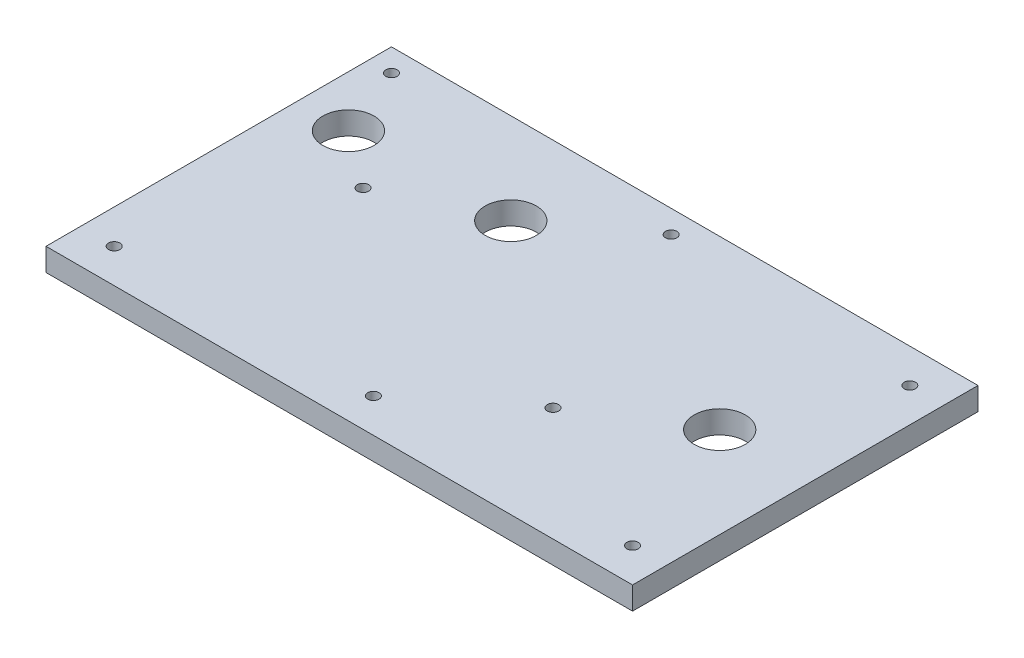
ISO-10303-21;
HEADER;
FILE_DESCRIPTION(('STEP AP214'),'2;1');
FILE_NAME('part.step','',(''),(''),'','','');
FILE_SCHEMA(('AUTOMOTIVE_DESIGN { 1 0 10303 214 1 1 1 1 }'));
ENDSEC;
DATA;
#1=APPLICATION_CONTEXT('core data for automotive mechanical design processes');
#2=APPLICATION_PROTOCOL_DEFINITION('international standard','automotive_design',2000,#1);
#3=PRODUCT_CONTEXT('',#1,'mechanical');
#4=PRODUCT('Part','Part','',(#3));
#5=PRODUCT_RELATED_PRODUCT_CATEGORY('part','',(#4));
#6=PRODUCT_DEFINITION_FORMATION('','',#4);
#7=PRODUCT_DEFINITION_CONTEXT('part definition',#1,'design');
#8=PRODUCT_DEFINITION('design','',#6,#7);
#9=PRODUCT_DEFINITION_SHAPE('','',#8);
#10=(LENGTH_UNIT() NAMED_UNIT(*) SI_UNIT(.MILLI.,.METRE.));
#11=(NAMED_UNIT(*) PLANE_ANGLE_UNIT() SI_UNIT($,.RADIAN.));
#12=(NAMED_UNIT(*) SI_UNIT($,.STERADIAN.) SOLID_ANGLE_UNIT());
#13=UNCERTAINTY_MEASURE_WITH_UNIT(LENGTH_MEASURE(1.E-05),#10,'distance_accuracy_value','');
#14=(GEOMETRIC_REPRESENTATION_CONTEXT(3) GLOBAL_UNCERTAINTY_ASSIGNED_CONTEXT((#13)) GLOBAL_UNIT_ASSIGNED_CONTEXT((#10,
#11,#12)) REPRESENTATION_CONTEXT('',''));
#15=CARTESIAN_POINT('',(0.,0.,0.));
#16=DIRECTION('',(0.,0.,1.));
#17=DIRECTION('',(1.,0.,0.));
#18=AXIS2_PLACEMENT_3D('',#15,#16,#17);
#19=CARTESIAN_POINT('',(0.,12.7,0.));
#20=DIRECTION('',(0.,1.,0.));
#21=DIRECTION('',(0.,0.,1.));
#22=AXIS2_PLACEMENT_3D('',#19,#20,#21);
#23=PLANE('',#22);
#24=CARTESIAN_POINT('',(-57.15,12.7,25.4));
#25=DIRECTION('',(0.,1.,0.));
#26=DIRECTION('',(0.,0.,1.));
#27=AXIS2_PLACEMENT_3D('',#24,#25,#26);
#28=CIRCLE('',#27,3.175);
#29=CARTESIAN_POINT('',(-57.15,12.7,28.575));
#30=VERTEX_POINT('',#29);
#31=EDGE_CURVE('E202',#30,#30,#28,.T.);
#32=ORIENTED_EDGE('',*,*,#31,.F.);
#33=EDGE_LOOP('',(#32));
#34=FACE_BOUND('',#33,.T.);
#35=CARTESIAN_POINT('',(46.3996786,12.7,123.19));
#36=DIRECTION('',(0.,1.,0.));
#37=DIRECTION('',(0.,0.,1.));
#38=AXIS2_PLACEMENT_3D('',#35,#36,#37);
#39=CIRCLE('',#38,3.175);
#40=CARTESIAN_POINT('',(46.3996786,12.7,126.365));
#41=VERTEX_POINT('',#40);
#42=EDGE_CURVE('E186',#41,#41,#39,.T.);
#43=ORIENTED_EDGE('',*,*,#42,.F.);
#44=EDGE_LOOP('',(#43));
#45=FACE_BOUND('',#44,.T.);
#46=CARTESIAN_POINT('',(191.224353920325,12.7,-31.75));
#47=DIRECTION('',(0.,1.,0.));
#48=DIRECTION('',(0.,0.,1.));
#49=AXIS2_PLACEMENT_3D('',#46,#47,#48);
#50=CIRCLE('',#49,3.175);
#51=CARTESIAN_POINT('',(191.224353920325,12.7,-28.575));
#52=VERTEX_POINT('',#51);
#53=EDGE_CURVE('E170',#52,#52,#50,.T.);
#54=ORIENTED_EDGE('',*,*,#53,.F.);
#55=EDGE_LOOP('',(#54));
#56=FACE_BOUND('',#55,.T.);
#57=CARTESIAN_POINT('',(-98.425,12.7,123.19));
#58=DIRECTION('',(0.,1.,0.));
#59=DIRECTION('',(0.,0.,1.));
#60=AXIS2_PLACEMENT_3D('',#57,#58,#59);
#61=CIRCLE('',#60,3.175);
#62=CARTESIAN_POINT('',(-98.425,12.7,126.365));
#63=VERTEX_POINT('',#62);
#64=EDGE_CURVE('E154',#63,#63,#61,.T.);
#65=ORIENTED_EDGE('',*,*,#64,.F.);
#66=EDGE_LOOP('',(#65));
#67=FACE_BOUND('',#66,.T.);
#68=CARTESIAN_POINT('',(159.474353920325,12.7,42.7310243464263));
#69=DIRECTION('',(0.,1.,0.));
#70=DIRECTION('',(0.,0.,1.));
#71=AXIS2_PLACEMENT_3D('',#68,#69,#70);
#72=CIRCLE('',#71,14.2875);
#73=CARTESIAN_POINT('',(159.474353920325,12.7,57.0185243464263));
#74=VERTEX_POINT('',#73);
#75=EDGE_CURVE('E138',#74,#74,#72,.T.);
#76=ORIENTED_EDGE('',*,*,#75,.F.);
#77=EDGE_LOOP('',(#76));
#78=FACE_BOUND('',#77,.T.);
#79=DIRECTION('',(0.,0.,1.));
#80=VECTOR('',#79,1.);
#81=CARTESIAN_POINT('',(-117.475,12.7,-50.8));
#82=LINE('',#81,#80);
#83=CARTESIAN_POINT('',(-117.475,12.7,-50.8));
#84=VERTEX_POINT('',#83);
#85=CARTESIAN_POINT('',(-117.475,12.7,142.24));
#86=VERTEX_POINT('',#85);
#87=EDGE_CURVE('E96',#84,#86,#82,.T.);
#88=ORIENTED_EDGE('',*,*,#87,.T.);
#89=DIRECTION('',(1.,0.,0.));
#90=VECTOR('',#89,1.);
#91=CARTESIAN_POINT('',(-117.475,12.7,142.24));
#92=LINE('',#91,#90);
#93=CARTESIAN_POINT('',(210.274353920325,12.7,142.24));
#94=VERTEX_POINT('',#93);
#95=EDGE_CURVE('E91',#86,#94,#92,.T.);
#96=ORIENTED_EDGE('',*,*,#95,.T.);
#97=DIRECTION('',(0.,0.,-1.));
#98=VECTOR('',#97,1.);
#99=CARTESIAN_POINT('',(210.274353920325,12.7,-50.8));
#100=LINE('',#99,#98);
#101=CARTESIAN_POINT('',(210.274353920325,12.7,-50.8));
#102=VERTEX_POINT('',#101);
#103=EDGE_CURVE('E94',#94,#102,#100,.T.);
#104=ORIENTED_EDGE('',*,*,#103,.T.);
#105=DIRECTION('',(-1.,0.,0.));
#106=VECTOR('',#105,1.);
#107=CARTESIAN_POINT('',(-117.475,12.7,-50.8));
#108=LINE('',#107,#106);
#109=EDGE_CURVE('E61',#102,#84,#108,.T.);
#110=ORIENTED_EDGE('',*,*,#109,.T.);
#111=EDGE_LOOP('',(#88,#96,#104,#110));
#112=FACE_BOUND('',#111,.T.);
#113=CARTESIAN_POINT('',(0.,12.7,0.));
#114=DIRECTION('',(0.,1.,0.));
#115=DIRECTION('',(0.,0.,1.));
#116=AXIS2_PLACEMENT_3D('',#113,#114,#115);
#117=CIRCLE('',#116,14.2875);
#118=CARTESIAN_POINT('',(0.,12.7,14.2875));
#119=VERTEX_POINT('',#118);
#120=EDGE_CURVE('E116',#119,#119,#117,.T.);
#121=ORIENTED_EDGE('',*,*,#120,.F.);
#122=EDGE_LOOP('',(#121));
#123=FACE_BOUND('',#122,.T.);
#124=CARTESIAN_POINT('',(-88.9,12.7,1.8179314007295));
#125=DIRECTION('',(0.,1.,0.));
#126=DIRECTION('',(0.,0.,1.));
#127=AXIS2_PLACEMENT_3D('',#124,#125,#126);
#128=CIRCLE('',#127,14.2875);
#129=CARTESIAN_POINT('',(-88.9,12.7,16.1054314007295));
#130=VERTEX_POINT('',#129);
#131=EDGE_CURVE('E146',#130,#130,#128,.T.);
#132=ORIENTED_EDGE('',*,*,#131,.F.);
#133=EDGE_LOOP('',(#132));
#134=FACE_BOUND('',#133,.T.);
#135=CARTESIAN_POINT('',(191.224353920325,12.7,123.19));
#136=DIRECTION('',(0.,1.,0.));
#137=DIRECTION('',(0.,0.,1.));
#138=AXIS2_PLACEMENT_3D('',#135,#136,#137);
#139=CIRCLE('',#138,3.175);
#140=CARTESIAN_POINT('',(191.224353920325,12.7,126.365));
#141=VERTEX_POINT('',#140);
#142=EDGE_CURVE('E162',#141,#141,#139,.T.);
#143=ORIENTED_EDGE('',*,*,#142,.F.);
#144=EDGE_LOOP('',(#143));
#145=FACE_BOUND('',#144,.T.);
#146=CARTESIAN_POINT('',(102.324353920325,12.7,78.74));
#147=DIRECTION('',(0.,1.,0.));
#148=DIRECTION('',(0.,0.,1.));
#149=AXIS2_PLACEMENT_3D('',#146,#147,#148);
#150=CIRCLE('',#149,3.175);
#151=CARTESIAN_POINT('',(102.324353920325,12.7,81.915));
#152=VERTEX_POINT('',#151);
#153=EDGE_CURVE('E178',#152,#152,#150,.T.);
#154=ORIENTED_EDGE('',*,*,#153,.F.);
#155=EDGE_LOOP('',(#154));
#156=FACE_BOUND('',#155,.T.);
#157=CARTESIAN_POINT('',(-104.775,12.7,-38.1));
#158=DIRECTION('',(0.,1.,0.));
#159=DIRECTION('',(0.,0.,1.));
#160=AXIS2_PLACEMENT_3D('',#157,#158,#159);
#161=CIRCLE('',#160,3.175);
#162=CARTESIAN_POINT('',(-104.775,12.7,-34.925));
#163=VERTEX_POINT('',#162);
#164=EDGE_CURVE('E194',#163,#163,#161,.T.);
#165=ORIENTED_EDGE('',*,*,#164,.F.);
#166=EDGE_LOOP('',(#165));
#167=FACE_BOUND('',#166,.T.);
#168=CARTESIAN_POINT('',(51.5243539203251,12.7,-38.1));
#169=DIRECTION('',(0.,1.,0.));
#170=DIRECTION('',(0.,0.,1.));
#171=AXIS2_PLACEMENT_3D('',#168,#169,#170);
#172=CIRCLE('',#171,3.175);
#173=CARTESIAN_POINT('',(51.5243539203251,12.7,-34.925));
#174=VERTEX_POINT('',#173);
#175=EDGE_CURVE('E210',#174,#174,#172,.T.);
#176=ORIENTED_EDGE('',*,*,#175,.F.);
#177=EDGE_LOOP('',(#176));
#178=FACE_BOUND('',#177,.T.);
#179=ADVANCED_FACE('F43',(#34,#45,#56,#67,#78,#112,#123,#134,#145,#156,#167,#178),#23,.T.);
#180=CARTESIAN_POINT('',(0.,0.,0.));
#181=DIRECTION('',(0.,1.,0.));
#182=DIRECTION('',(0.,0.,1.));
#183=AXIS2_PLACEMENT_3D('',#180,#181,#182);
#184=PLANE('',#183);
#185=DIRECTION('',(0.,0.,1.));
#186=VECTOR('',#185,1.);
#187=CARTESIAN_POINT('',(-117.475,0.,-50.8));
#188=LINE('',#187,#186);
#189=CARTESIAN_POINT('',(-117.475,0.,-50.8));
#190=VERTEX_POINT('',#189);
#191=CARTESIAN_POINT('',(-117.475,0.,142.24));
#192=VERTEX_POINT('',#191);
#193=EDGE_CURVE('E112',#190,#192,#188,.T.);
#194=ORIENTED_EDGE('',*,*,#193,.F.);
#195=DIRECTION('',(-1.,0.,0.));
#196=VECTOR('',#195,1.);
#197=CARTESIAN_POINT('',(-117.475,0.,-50.8));
#198=LINE('',#197,#196);
#199=CARTESIAN_POINT('',(210.274353920325,0.,-50.8));
#200=VERTEX_POINT('',#199);
#201=EDGE_CURVE('E84',#200,#190,#198,.T.);
#202=ORIENTED_EDGE('',*,*,#201,.F.);
#203=DIRECTION('',(0.,0.,-1.));
#204=VECTOR('',#203,1.);
#205=CARTESIAN_POINT('',(210.274353920325,0.,-50.8));
#206=LINE('',#205,#204);
#207=CARTESIAN_POINT('',(210.274353920325,0.,142.24));
#208=VERTEX_POINT('',#207);
#209=EDGE_CURVE('E78',#208,#200,#206,.T.);
#210=ORIENTED_EDGE('',*,*,#209,.F.);
#211=DIRECTION('',(1.,0.,0.));
#212=VECTOR('',#211,1.);
#213=CARTESIAN_POINT('',(-117.475,0.,142.24));
#214=LINE('',#213,#212);
#215=EDGE_CURVE('E101',#192,#208,#214,.T.);
#216=ORIENTED_EDGE('',*,*,#215,.F.);
#217=EDGE_LOOP('',(#194,#202,#210,#216));
#218=FACE_BOUND('',#217,.T.);
#219=CARTESIAN_POINT('',(0.,0.,0.));
#220=DIRECTION('',(0.,1.,0.));
#221=DIRECTION('',(0.,0.,1.));
#222=AXIS2_PLACEMENT_3D('',#219,#220,#221);
#223=CIRCLE('',#222,14.2875);
#224=CARTESIAN_POINT('',(0.,0.,14.2875));
#225=VERTEX_POINT('',#224);
#226=EDGE_CURVE('E134',#225,#225,#223,.T.);
#227=ORIENTED_EDGE('',*,*,#226,.T.);
#228=EDGE_LOOP('',(#227));
#229=FACE_BOUND('',#228,.T.);
#230=CARTESIAN_POINT('',(159.474353920325,0.,42.7310243464263));
#231=DIRECTION('',(0.,1.,0.));
#232=DIRECTION('',(0.,0.,1.));
#233=AXIS2_PLACEMENT_3D('',#230,#231,#232);
#234=CIRCLE('',#233,14.2875);
#235=CARTESIAN_POINT('',(159.474353920325,0.,57.0185243464263));
#236=VERTEX_POINT('',#235);
#237=EDGE_CURVE('E142',#236,#236,#234,.T.);
#238=ORIENTED_EDGE('',*,*,#237,.T.);
#239=EDGE_LOOP('',(#238));
#240=FACE_BOUND('',#239,.T.);
#241=CARTESIAN_POINT('',(-88.9,0.,1.8179314007295));
#242=DIRECTION('',(0.,1.,0.));
#243=DIRECTION('',(0.,0.,1.));
#244=AXIS2_PLACEMENT_3D('',#241,#242,#243);
#245=CIRCLE('',#244,14.2875);
#246=CARTESIAN_POINT('',(-88.9,0.,16.1054314007295));
#247=VERTEX_POINT('',#246);
#248=EDGE_CURVE('E150',#247,#247,#245,.T.);
#249=ORIENTED_EDGE('',*,*,#248,.T.);
#250=EDGE_LOOP('',(#249));
#251=FACE_BOUND('',#250,.T.);
#252=CARTESIAN_POINT('',(-98.425,0.,123.19));
#253=DIRECTION('',(0.,1.,0.));
#254=DIRECTION('',(0.,0.,1.));
#255=AXIS2_PLACEMENT_3D('',#252,#253,#254);
#256=CIRCLE('',#255,3.175);
#257=CARTESIAN_POINT('',(-98.425,0.,126.365));
#258=VERTEX_POINT('',#257);
#259=EDGE_CURVE('E158',#258,#258,#256,.T.);
#260=ORIENTED_EDGE('',*,*,#259,.T.);
#261=EDGE_LOOP('',(#260));
#262=FACE_BOUND('',#261,.T.);
#263=CARTESIAN_POINT('',(191.224353920325,0.,123.19));
#264=DIRECTION('',(0.,1.,0.));
#265=DIRECTION('',(0.,0.,1.));
#266=AXIS2_PLACEMENT_3D('',#263,#264,#265);
#267=CIRCLE('',#266,3.175);
#268=CARTESIAN_POINT('',(191.224353920325,0.,126.365));
#269=VERTEX_POINT('',#268);
#270=EDGE_CURVE('E166',#269,#269,#267,.T.);
#271=ORIENTED_EDGE('',*,*,#270,.T.);
#272=EDGE_LOOP('',(#271));
#273=FACE_BOUND('',#272,.T.);
#274=CARTESIAN_POINT('',(191.224353920325,0.,-31.75));
#275=DIRECTION('',(0.,1.,0.));
#276=DIRECTION('',(0.,0.,1.));
#277=AXIS2_PLACEMENT_3D('',#274,#275,#276);
#278=CIRCLE('',#277,3.175);
#279=CARTESIAN_POINT('',(191.224353920325,0.,-28.575));
#280=VERTEX_POINT('',#279);
#281=EDGE_CURVE('E174',#280,#280,#278,.T.);
#282=ORIENTED_EDGE('',*,*,#281,.T.);
#283=EDGE_LOOP('',(#282));
#284=FACE_BOUND('',#283,.T.);
#285=CARTESIAN_POINT('',(102.324353920325,0.,78.74));
#286=DIRECTION('',(0.,1.,0.));
#287=DIRECTION('',(0.,0.,1.));
#288=AXIS2_PLACEMENT_3D('',#285,#286,#287);
#289=CIRCLE('',#288,3.175);
#290=CARTESIAN_POINT('',(102.324353920325,0.,81.915));
#291=VERTEX_POINT('',#290);
#292=EDGE_CURVE('E182',#291,#291,#289,.T.);
#293=ORIENTED_EDGE('',*,*,#292,.T.);
#294=EDGE_LOOP('',(#293));
#295=FACE_BOUND('',#294,.T.);
#296=CARTESIAN_POINT('',(46.3996786,0.,123.19));
#297=DIRECTION('',(0.,1.,0.));
#298=DIRECTION('',(0.,0.,1.));
#299=AXIS2_PLACEMENT_3D('',#296,#297,#298);
#300=CIRCLE('',#299,3.175);
#301=CARTESIAN_POINT('',(46.3996786,0.,126.365));
#302=VERTEX_POINT('',#301);
#303=EDGE_CURVE('E190',#302,#302,#300,.T.);
#304=ORIENTED_EDGE('',*,*,#303,.T.);
#305=EDGE_LOOP('',(#304));
#306=FACE_BOUND('',#305,.T.);
#307=CARTESIAN_POINT('',(-104.775,0.,-38.1));
#308=DIRECTION('',(0.,1.,0.));
#309=DIRECTION('',(0.,0.,1.));
#310=AXIS2_PLACEMENT_3D('',#307,#308,#309);
#311=CIRCLE('',#310,3.175);
#312=CARTESIAN_POINT('',(-104.775,0.,-34.925));
#313=VERTEX_POINT('',#312);
#314=EDGE_CURVE('E198',#313,#313,#311,.T.);
#315=ORIENTED_EDGE('',*,*,#314,.T.);
#316=EDGE_LOOP('',(#315));
#317=FACE_BOUND('',#316,.T.);
#318=CARTESIAN_POINT('',(-57.15,0.,25.4));
#319=DIRECTION('',(0.,1.,0.));
#320=DIRECTION('',(0.,0.,1.));
#321=AXIS2_PLACEMENT_3D('',#318,#319,#320);
#322=CIRCLE('',#321,3.175);
#323=CARTESIAN_POINT('',(-57.15,0.,28.575));
#324=VERTEX_POINT('',#323);
#325=EDGE_CURVE('E206',#324,#324,#322,.T.);
#326=ORIENTED_EDGE('',*,*,#325,.T.);
#327=EDGE_LOOP('',(#326));
#328=FACE_BOUND('',#327,.T.);
#329=CARTESIAN_POINT('',(51.5243539203251,0.,-38.1));
#330=DIRECTION('',(0.,1.,0.));
#331=DIRECTION('',(0.,0.,1.));
#332=AXIS2_PLACEMENT_3D('',#329,#330,#331);
#333=CIRCLE('',#332,3.175);
#334=CARTESIAN_POINT('',(51.5243539203251,0.,-34.925));
#335=VERTEX_POINT('',#334);
#336=EDGE_CURVE('E214',#335,#335,#333,.T.);
#337=ORIENTED_EDGE('',*,*,#336,.T.);
#338=EDGE_LOOP('',(#337));
#339=FACE_BOUND('',#338,.T.);
#340=ADVANCED_FACE('F129',(#218,#229,#240,#251,#262,#273,#284,#295,#306,#317,#328,#339),#184,.F.);
#341=CARTESIAN_POINT('',(-117.475,12.7,-50.8));
#342=DIRECTION('',(1.,0.,0.));
#343=DIRECTION('',(0.,0.,-1.));
#344=AXIS2_PLACEMENT_3D('',#341,#342,#343);
#345=PLANE('',#344);
#346=ORIENTED_EDGE('',*,*,#193,.T.);
#347=DIRECTION('',(0.,-1.,0.));
#348=VECTOR('',#347,1.);
#349=CARTESIAN_POINT('',(-117.475,12.7,142.24));
#350=LINE('',#349,#348);
#351=EDGE_CURVE('E11',#86,#192,#350,.T.);
#352=ORIENTED_EDGE('',*,*,#351,.F.);
#353=ORIENTED_EDGE('',*,*,#87,.F.);
#354=DIRECTION('',(0.,-1.,0.));
#355=VECTOR('',#354,1.);
#356=CARTESIAN_POINT('',(-117.475,12.7,-50.8));
#357=LINE('',#356,#355);
#358=EDGE_CURVE('E108',#84,#190,#357,.T.);
#359=ORIENTED_EDGE('',*,*,#358,.T.);
#360=EDGE_LOOP('',(#346,#352,#353,#359));
#361=FACE_BOUND('',#360,.T.);
#362=ADVANCED_FACE('F45',(#361),#345,.F.);
#363=CARTESIAN_POINT('',(-117.475,12.7,142.24));
#364=DIRECTION('',(0.,0.,-1.));
#365=DIRECTION('',(-1.,0.,0.));
#366=AXIS2_PLACEMENT_3D('',#363,#364,#365);
#367=PLANE('',#366);
#368=ORIENTED_EDGE('',*,*,#215,.T.);
#369=DIRECTION('',(0.,-1.,0.));
#370=VECTOR('',#369,1.);
#371=CARTESIAN_POINT('',(210.274353920325,12.7,142.24));
#372=LINE('',#371,#370);
#373=EDGE_CURVE('E53',#94,#208,#372,.T.);
#374=ORIENTED_EDGE('',*,*,#373,.F.);
#375=ORIENTED_EDGE('',*,*,#95,.F.);
#376=ORIENTED_EDGE('',*,*,#351,.T.);
#377=EDGE_LOOP('',(#368,#374,#375,#376));
#378=FACE_BOUND('',#377,.T.);
#379=ADVANCED_FACE('F100',(#378),#367,.F.);
#380=CARTESIAN_POINT('',(210.274353920325,12.7,-50.8));
#381=DIRECTION('',(-1.,0.,0.));
#382=DIRECTION('',(0.,0.,1.));
#383=AXIS2_PLACEMENT_3D('',#380,#381,#382);
#384=PLANE('',#383);
#385=ORIENTED_EDGE('',*,*,#209,.T.);
#386=DIRECTION('',(0.,-1.,0.));
#387=VECTOR('',#386,1.);
#388=CARTESIAN_POINT('',(210.274353920325,12.7,-50.8));
#389=LINE('',#388,#387);
#390=EDGE_CURVE('E103',#102,#200,#389,.T.);
#391=ORIENTED_EDGE('',*,*,#390,.F.);
#392=ORIENTED_EDGE('',*,*,#103,.F.);
#393=ORIENTED_EDGE('',*,*,#373,.T.);
#394=EDGE_LOOP('',(#385,#391,#392,#393));
#395=FACE_BOUND('',#394,.T.);
#396=ADVANCED_FACE('F104',(#395),#384,.F.);
#397=CARTESIAN_POINT('',(-117.475,12.7,-50.8));
#398=DIRECTION('',(0.,0.,1.));
#399=DIRECTION('',(1.,0.,0.));
#400=AXIS2_PLACEMENT_3D('',#397,#398,#399);
#401=PLANE('',#400);
#402=ORIENTED_EDGE('',*,*,#201,.T.);
#403=ORIENTED_EDGE('',*,*,#358,.F.);
#404=ORIENTED_EDGE('',*,*,#109,.F.);
#405=ORIENTED_EDGE('',*,*,#390,.T.);
#406=EDGE_LOOP('',(#402,#403,#404,#405));
#407=FACE_BOUND('',#406,.T.);
#408=ADVANCED_FACE('F126',(#407),#401,.F.);
#409=CARTESIAN_POINT('',(0.,12.7,0.));
#410=DIRECTION('',(0.,-1.,0.));
#411=DIRECTION('',(0.,0.,-1.));
#412=AXIS2_PLACEMENT_3D('',#409,#410,#411);
#413=CYLINDRICAL_SURFACE('',#412,14.2875);
#414=ORIENTED_EDGE('',*,*,#120,.T.);
#415=EDGE_LOOP('',(#414));
#416=FACE_BOUND('',#415,.T.);
#417=ORIENTED_EDGE('',*,*,#226,.F.);
#418=EDGE_LOOP('',(#417));
#419=FACE_BOUND('',#418,.T.);
#420=ADVANCED_FACE('F235',(#416,#419),#413,.F.);
#421=CARTESIAN_POINT('',(159.474353920325,12.7,42.7310243464263));
#422=DIRECTION('',(0.,-1.,0.));
#423=DIRECTION('',(0.,0.,-1.));
#424=AXIS2_PLACEMENT_3D('',#421,#422,#423);
#425=CYLINDRICAL_SURFACE('',#424,14.2875);
#426=ORIENTED_EDGE('',*,*,#75,.T.);
#427=EDGE_LOOP('',(#426));
#428=FACE_BOUND('',#427,.T.);
#429=ORIENTED_EDGE('',*,*,#237,.F.);
#430=EDGE_LOOP('',(#429));
#431=FACE_BOUND('',#430,.T.);
#432=ADVANCED_FACE('F289',(#428,#431),#425,.F.);
#433=CARTESIAN_POINT('',(-88.9,12.7,1.8179314007295));
#434=DIRECTION('',(0.,-1.,0.));
#435=DIRECTION('',(0.,0.,-1.));
#436=AXIS2_PLACEMENT_3D('',#433,#434,#435);
#437=CYLINDRICAL_SURFACE('',#436,14.2875);
#438=ORIENTED_EDGE('',*,*,#131,.T.);
#439=EDGE_LOOP('',(#438));
#440=FACE_BOUND('',#439,.T.);
#441=ORIENTED_EDGE('',*,*,#248,.F.);
#442=EDGE_LOOP('',(#441));
#443=FACE_BOUND('',#442,.T.);
#444=ADVANCED_FACE('F298',(#440,#443),#437,.F.);
#445=CARTESIAN_POINT('',(-98.425,12.7,123.19));
#446=DIRECTION('',(0.,-1.,0.));
#447=DIRECTION('',(0.,0.,-1.));
#448=AXIS2_PLACEMENT_3D('',#445,#446,#447);
#449=CYLINDRICAL_SURFACE('',#448,3.175);
#450=ORIENTED_EDGE('',*,*,#64,.T.);
#451=EDGE_LOOP('',(#450));
#452=FACE_BOUND('',#451,.T.);
#453=ORIENTED_EDGE('',*,*,#259,.F.);
#454=EDGE_LOOP('',(#453));
#455=FACE_BOUND('',#454,.T.);
#456=ADVANCED_FACE('F307',(#452,#455),#449,.F.);
#457=CARTESIAN_POINT('',(191.224353920325,12.7,123.19));
#458=DIRECTION('',(0.,-1.,0.));
#459=DIRECTION('',(0.,0.,-1.));
#460=AXIS2_PLACEMENT_3D('',#457,#458,#459);
#461=CYLINDRICAL_SURFACE('',#460,3.175);
#462=ORIENTED_EDGE('',*,*,#142,.T.);
#463=EDGE_LOOP('',(#462));
#464=FACE_BOUND('',#463,.T.);
#465=ORIENTED_EDGE('',*,*,#270,.F.);
#466=EDGE_LOOP('',(#465));
#467=FACE_BOUND('',#466,.T.);
#468=ADVANCED_FACE('F317',(#464,#467),#461,.F.);
#469=CARTESIAN_POINT('',(191.224353920325,12.7,-31.75));
#470=DIRECTION('',(0.,-1.,0.));
#471=DIRECTION('',(0.,0.,-1.));
#472=AXIS2_PLACEMENT_3D('',#469,#470,#471);
#473=CYLINDRICAL_SURFACE('',#472,3.175);
#474=ORIENTED_EDGE('',*,*,#53,.T.);
#475=EDGE_LOOP('',(#474));
#476=FACE_BOUND('',#475,.T.);
#477=ORIENTED_EDGE('',*,*,#281,.F.);
#478=EDGE_LOOP('',(#477));
#479=FACE_BOUND('',#478,.T.);
#480=ADVANCED_FACE('F327',(#476,#479),#473,.F.);
#481=CARTESIAN_POINT('',(102.324353920325,12.7,78.74));
#482=DIRECTION('',(0.,-1.,0.));
#483=DIRECTION('',(0.,0.,-1.));
#484=AXIS2_PLACEMENT_3D('',#481,#482,#483);
#485=CYLINDRICAL_SURFACE('',#484,3.175);
#486=ORIENTED_EDGE('',*,*,#153,.T.);
#487=EDGE_LOOP('',(#486));
#488=FACE_BOUND('',#487,.T.);
#489=ORIENTED_EDGE('',*,*,#292,.F.);
#490=EDGE_LOOP('',(#489));
#491=FACE_BOUND('',#490,.T.);
#492=ADVANCED_FACE('F337',(#488,#491),#485,.F.);
#493=CARTESIAN_POINT('',(46.3996786,12.7,123.19));
#494=DIRECTION('',(0.,-1.,0.));
#495=DIRECTION('',(0.,0.,-1.));
#496=AXIS2_PLACEMENT_3D('',#493,#494,#495);
#497=CYLINDRICAL_SURFACE('',#496,3.175);
#498=ORIENTED_EDGE('',*,*,#42,.T.);
#499=EDGE_LOOP('',(#498));
#500=FACE_BOUND('',#499,.T.);
#501=ORIENTED_EDGE('',*,*,#303,.F.);
#502=EDGE_LOOP('',(#501));
#503=FACE_BOUND('',#502,.T.);
#504=ADVANCED_FACE('F347',(#500,#503),#497,.F.);
#505=CARTESIAN_POINT('',(-104.775,12.7,-38.1));
#506=DIRECTION('',(0.,-1.,0.));
#507=DIRECTION('',(0.,0.,-1.));
#508=AXIS2_PLACEMENT_3D('',#505,#506,#507);
#509=CYLINDRICAL_SURFACE('',#508,3.175);
#510=ORIENTED_EDGE('',*,*,#164,.T.);
#511=EDGE_LOOP('',(#510));
#512=FACE_BOUND('',#511,.T.);
#513=ORIENTED_EDGE('',*,*,#314,.F.);
#514=EDGE_LOOP('',(#513));
#515=FACE_BOUND('',#514,.T.);
#516=ADVANCED_FACE('F357',(#512,#515),#509,.F.);
#517=CARTESIAN_POINT('',(-57.15,12.7,25.4));
#518=DIRECTION('',(0.,-1.,0.));
#519=DIRECTION('',(0.,0.,-1.));
#520=AXIS2_PLACEMENT_3D('',#517,#518,#519);
#521=CYLINDRICAL_SURFACE('',#520,3.175);
#522=ORIENTED_EDGE('',*,*,#31,.T.);
#523=EDGE_LOOP('',(#522));
#524=FACE_BOUND('',#523,.T.);
#525=ORIENTED_EDGE('',*,*,#325,.F.);
#526=EDGE_LOOP('',(#525));
#527=FACE_BOUND('',#526,.T.);
#528=ADVANCED_FACE('F367',(#524,#527),#521,.F.);
#529=CARTESIAN_POINT('',(51.5243539203251,12.7,-38.1));
#530=DIRECTION('',(0.,-1.,0.));
#531=DIRECTION('',(0.,0.,-1.));
#532=AXIS2_PLACEMENT_3D('',#529,#530,#531);
#533=CYLINDRICAL_SURFACE('',#532,3.175);
#534=ORIENTED_EDGE('',*,*,#175,.T.);
#535=EDGE_LOOP('',(#534));
#536=FACE_BOUND('',#535,.T.);
#537=ORIENTED_EDGE('',*,*,#336,.F.);
#538=EDGE_LOOP('',(#537));
#539=FACE_BOUND('',#538,.T.);
#540=ADVANCED_FACE('F222',(#536,#539),#533,.F.);
#541=CLOSED_SHELL('',(#179,#340,#362,#379,#396,#408,#420,#432,#444,#456,#468,#480,#492,#504,
#516,#528,#540));
#542=MANIFOLD_SOLID_BREP('B2',#541);
#543=ADVANCED_BREP_SHAPE_REPRESENTATION('',(#18,#542),#14);
#544=SHAPE_DEFINITION_REPRESENTATION(#9,#543);
ENDSEC;
END-ISO-10303-21;
